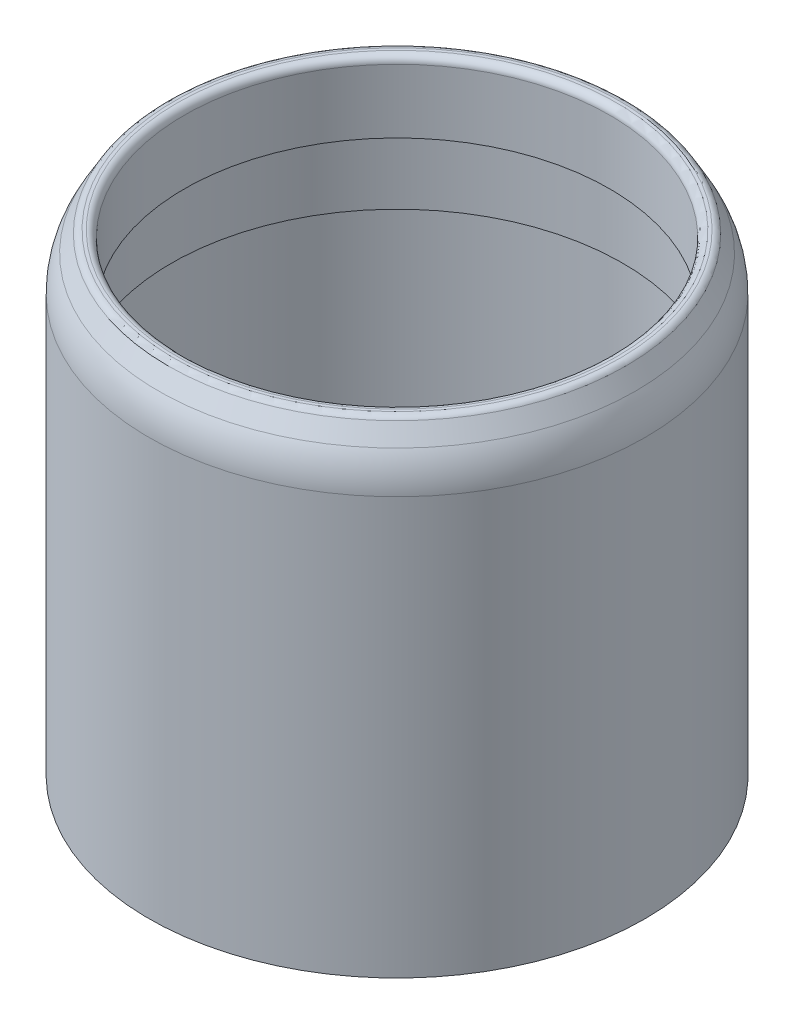
ISO-10303-21;
HEADER;
FILE_DESCRIPTION(('STEP AP214'),'2;1');
FILE_NAME('part.step','',(''),(''),'','','');
FILE_SCHEMA(('AUTOMOTIVE_DESIGN { 1 0 10303 214 1 1 1 1 }'));
ENDSEC;
DATA;
#1=APPLICATION_CONTEXT('core data for automotive mechanical design processes');
#2=APPLICATION_PROTOCOL_DEFINITION('international standard','automotive_design',2000,#1);
#3=PRODUCT_CONTEXT('',#1,'mechanical');
#4=PRODUCT('Part','Part','',(#3));
#5=PRODUCT_RELATED_PRODUCT_CATEGORY('part','',(#4));
#6=PRODUCT_DEFINITION_FORMATION('','',#4);
#7=PRODUCT_DEFINITION_CONTEXT('part definition',#1,'design');
#8=PRODUCT_DEFINITION('design','',#6,#7);
#9=PRODUCT_DEFINITION_SHAPE('','',#8);
#10=(LENGTH_UNIT() NAMED_UNIT(*) SI_UNIT(.MILLI.,.METRE.));
#11=(NAMED_UNIT(*) PLANE_ANGLE_UNIT() SI_UNIT($,.RADIAN.));
#12=(NAMED_UNIT(*) SI_UNIT($,.STERADIAN.) SOLID_ANGLE_UNIT());
#13=UNCERTAINTY_MEASURE_WITH_UNIT(LENGTH_MEASURE(1.E-05),#10,'distance_accuracy_value','');
#14=(GEOMETRIC_REPRESENTATION_CONTEXT(3) GLOBAL_UNCERTAINTY_ASSIGNED_CONTEXT((#13)) GLOBAL_UNIT_ASSIGNED_CONTEXT((#10,
#11,#12)) REPRESENTATION_CONTEXT('',''));
#15=CARTESIAN_POINT('',(0.,0.,0.));
#16=DIRECTION('',(0.,0.,1.));
#17=DIRECTION('',(1.,0.,0.));
#18=AXIS2_PLACEMENT_3D('',#15,#16,#17);
#19=CARTESIAN_POINT('',(9.,-0.3,0.));
#20=DIRECTION('',(0.,-1.,0.));
#21=DIRECTION('',(-0.999982833638038,0.,0.00585938812848122));
#22=AXIS2_PLACEMENT_3D('',#19,#20,#21);
#23=TOROIDAL_SURFACE('',#22,9.426794919243,0.3);
#24=CARTESIAN_POINT('',(9.,-0.1500000056238,0.));
#25=DIRECTION('',(0.,-1.,0.));
#26=DIRECTION('',(-1.,0.,0.));
#27=AXIS2_PLACEMENT_3D('',#24,#25,#26);
#28=CIRCLE('',#27,9.686602543625);
#29=CARTESIAN_POINT('',(18.686602543625,-0.150000005623806,0.));
#30=VERTEX_POINT('',#29);
#31=CARTESIAN_POINT('',(18.6864362598996,-0.1500000056238,-0.0567575639494312));
#32=VERTEX_POINT('',#31);
#33=EDGE_CURVE('E117',#30,#32,#28,.T.);
#34=ORIENTED_EDGE('',*,*,#33,.F.);
#35=CARTESIAN_POINT('',(9.,-0.1500000056238,0.));
#36=DIRECTION('',(0.,-1.,0.));
#37=DIRECTION('',(-1.,0.,0.));
#38=AXIS2_PLACEMENT_3D('',#35,#36,#37);
#39=CIRCLE('',#38,9.686602543625);
#40=EDGE_CURVE('E28',#32,#30,#39,.T.);
#41=ORIENTED_EDGE('',*,*,#40,.F.);
#42=CARTESIAN_POINT('',(18.4266330954693,-0.3,-0.0552352502394384));
#43=DIRECTION('',(0.0058593881284811,0.,0.999982833638038));
#44=DIRECTION('',(0.999982833638038,0.,-0.0058593881284811));
#45=AXIS2_PLACEMENT_3D('',#42,#43,#44);
#46=CIRCLE('',#45,0.3);
#47=CARTESIAN_POINT('',(18.426633109589,0.,-0.055235250322173));
#48=VERTEX_POINT('',#47);
#49=EDGE_CURVE('E11',#32,#48,#46,.T.);
#50=ORIENTED_EDGE('',*,*,#49,.T.);
#51=CARTESIAN_POINT('',(9.,0.,0.));
#52=DIRECTION('',(0.,-1.,0.));
#53=DIRECTION('',(-1.,0.,0.));
#54=AXIS2_PLACEMENT_3D('',#51,#52,#53);
#55=CIRCLE('',#54,9.426794933363);
#56=EDGE_CURVE('E123',#48,#48,#55,.T.);
#57=ORIENTED_EDGE('',*,*,#56,.T.);
#58=ORIENTED_EDGE('',*,*,#49,.F.);
#59=EDGE_LOOP('',(#34,#41,#50,#57,#58));
#60=FACE_BOUND('',#59,.T.);
#61=ADVANCED_FACE('F17',(#60),#23,.T.);
#62=CARTESIAN_POINT('',(9.,-0.5063464648881,0.));
#63=DIRECTION('',(0.,-1.,0.));
#64=DIRECTION('',(-1.,0.,0.));
#65=AXIS2_PLACEMENT_3D('',#62,#63,#64);
#66=CONICAL_SURFACE('',#65,9.892339267806,0.523598775598299);
#67=CARTESIAN_POINT('',(9.,-0.8626933041054,0.));
#68=DIRECTION('',(0.,1.,0.));
#69=DIRECTION('',(-1.,0.,0.));
#70=AXIS2_PLACEMENT_3D('',#67,#68,#69);
#71=CIRCLE('',#70,10.09807621135);
#72=CARTESIAN_POINT('',(19.09807621135,-0.8626933041054,0.));
#73=VERTEX_POINT('',#72);
#74=EDGE_CURVE('E154',#73,#73,#71,.T.);
#75=ORIENTED_EDGE('',*,*,#74,.T.);
#76=DIRECTION('',(-0.5,0.866025403784439,0.));
#77=VECTOR('',#76,1.);
#78=CARTESIAN_POINT('',(18.892339267806,-0.5063464648881,0.));
#79=LINE('',#78,#77);
#80=EDGE_CURVE('E158',#73,#30,#79,.T.);
#81=ORIENTED_EDGE('',*,*,#80,.T.);
#82=ORIENTED_EDGE('',*,*,#33,.T.);
#83=ORIENTED_EDGE('',*,*,#40,.T.);
#84=ORIENTED_EDGE('',*,*,#80,.F.);
#85=EDGE_LOOP('',(#75,#81,#82,#83,#84));
#86=FACE_BOUND('',#85,.T.);
#87=ADVANCED_FACE('F183',(#86),#66,.T.);
#88=CARTESIAN_POINT('',(9.,-2.362693304105,0.));
#89=DIRECTION('',(0.,-1.,0.));
#90=DIRECTION('',(-1.,0.,0.));
#91=AXIS2_PLACEMENT_3D('',#88,#89,#90);
#92=TOROIDAL_SURFACE('',#91,7.5,3.);
#93=CARTESIAN_POINT('',(9.,-2.362693304105,0.));
#94=DIRECTION('',(0.,-1.,0.));
#95=DIRECTION('',(-1.,0.,0.));
#96=AXIS2_PLACEMENT_3D('',#93,#94,#95);
#97=CIRCLE('',#96,10.5);
#98=CARTESIAN_POINT('',(19.5,-2.362693304105,0.));
#99=VERTEX_POINT('',#98);
#100=EDGE_CURVE('E100',#99,#99,#97,.T.);
#101=ORIENTED_EDGE('',*,*,#100,.F.);
#102=CARTESIAN_POINT('',(16.5,-2.362693304105,0.));
#103=DIRECTION('',(0.,0.,1.));
#104=DIRECTION('',(1.,0.,0.));
#105=AXIS2_PLACEMENT_3D('',#102,#103,#104);
#106=CIRCLE('',#105,3.);
#107=EDGE_CURVE('E131',#99,#73,#106,.T.);
#108=ORIENTED_EDGE('',*,*,#107,.T.);
#109=ORIENTED_EDGE('',*,*,#74,.F.);
#110=ORIENTED_EDGE('',*,*,#107,.F.);
#111=EDGE_LOOP('',(#101,#108,#109,#110));
#112=FACE_BOUND('',#111,.T.);
#113=ADVANCED_FACE('F206',(#112),#92,.T.);
#114=CARTESIAN_POINT('',(9.,1.,0.));
#115=DIRECTION('',(0.,-1.,0.));
#116=DIRECTION('',(-1.,0.,0.));
#117=AXIS2_PLACEMENT_3D('',#114,#115,#116);
#118=CYLINDRICAL_SURFACE('',#117,10.5);
#119=CARTESIAN_POINT('',(9.,-20.,0.));
#120=DIRECTION('',(0.,-1.,0.));
#121=DIRECTION('',(-1.,0.,0.));
#122=AXIS2_PLACEMENT_3D('',#119,#120,#121);
#123=CIRCLE('',#122,10.5);
#124=CARTESIAN_POINT('',(19.5,-20.,0.));
#125=VERTEX_POINT('',#124);
#126=EDGE_CURVE('E98',#125,#125,#123,.T.);
#127=ORIENTED_EDGE('',*,*,#126,.F.);
#128=DIRECTION('',(0.,1.,0.));
#129=VECTOR('',#128,1.);
#130=CARTESIAN_POINT('',(19.5,1.,0.));
#131=LINE('',#130,#129);
#132=EDGE_CURVE('E95',#125,#99,#131,.T.);
#133=ORIENTED_EDGE('',*,*,#132,.T.);
#134=ORIENTED_EDGE('',*,*,#100,.T.);
#135=ORIENTED_EDGE('',*,*,#132,.F.);
#136=EDGE_LOOP('',(#127,#133,#134,#135));
#137=FACE_BOUND('',#136,.T.);
#138=ADVANCED_FACE('F97',(#137),#118,.T.);
#139=CARTESIAN_POINT('',(9.,-20.,0.));
#140=DIRECTION('',(0.,-1.,0.));
#141=DIRECTION('',(0.,0.,-1.));
#142=AXIS2_PLACEMENT_3D('',#139,#140,#141);
#143=PLANE('',#142);
#144=CARTESIAN_POINT('',(9.,-20.,0.));
#145=DIRECTION('',(0.,-1.,0.));
#146=DIRECTION('',(-1.,0.,0.));
#147=AXIS2_PLACEMENT_3D('',#144,#145,#146);
#148=CIRCLE('',#147,9.55);
#149=CARTESIAN_POINT('',(18.55,-20.,0.));
#150=VERTEX_POINT('',#149);
#151=EDGE_CURVE('E106',#150,#150,#148,.T.);
#152=ORIENTED_EDGE('',*,*,#151,.F.);
#153=EDGE_LOOP('',(#152));
#154=FACE_BOUND('',#153,.T.);
#155=ORIENTED_EDGE('',*,*,#126,.T.);
#156=EDGE_LOOP('',(#155));
#157=FACE_BOUND('',#156,.T.);
#158=ADVANCED_FACE('F104',(#154,#157),#143,.T.);
#159=CARTESIAN_POINT('',(9.,1.,0.));
#160=DIRECTION('',(0.,-1.,0.));
#161=DIRECTION('',(-1.,0.,0.));
#162=AXIS2_PLACEMENT_3D('',#159,#160,#161);
#163=CYLINDRICAL_SURFACE('',#162,9.55);
#164=CARTESIAN_POINT('',(9.,-18.,0.));
#165=DIRECTION('',(0.,-1.,0.));
#166=DIRECTION('',(-1.,0.,0.));
#167=AXIS2_PLACEMENT_3D('',#164,#165,#166);
#168=CIRCLE('',#167,9.55);
#169=CARTESIAN_POINT('',(18.55,-18.,0.));
#170=VERTEX_POINT('',#169);
#171=EDGE_CURVE('E141',#170,#170,#168,.T.);
#172=ORIENTED_EDGE('',*,*,#171,.F.);
#173=DIRECTION('',(0.,-1.,0.));
#174=VECTOR('',#173,1.);
#175=CARTESIAN_POINT('',(18.55,1.,0.));
#176=LINE('',#175,#174);
#177=EDGE_CURVE('E112',#170,#150,#176,.T.);
#178=ORIENTED_EDGE('',*,*,#177,.T.);
#179=ORIENTED_EDGE('',*,*,#151,.T.);
#180=ORIENTED_EDGE('',*,*,#177,.F.);
#181=EDGE_LOOP('',(#172,#178,#179,#180));
#182=FACE_BOUND('',#181,.T.);
#183=ADVANCED_FACE('F209',(#182),#163,.F.);
#184=CARTESIAN_POINT('',(9.,-18.,0.));
#185=DIRECTION('',(0.,-1.,0.));
#186=DIRECTION('',(0.,0.,-1.));
#187=AXIS2_PLACEMENT_3D('',#184,#185,#186);
#188=PLANE('',#187);
#189=ORIENTED_EDGE('',*,*,#171,.T.);
#190=EDGE_LOOP('',(#189));
#191=FACE_BOUND('',#190,.T.);
#192=CARTESIAN_POINT('',(9.,-18.,0.));
#193=DIRECTION('',(0.,-1.,0.));
#194=DIRECTION('',(-1.,0.,0.));
#195=AXIS2_PLACEMENT_3D('',#192,#193,#194);
#196=CIRCLE('',#195,9.75);
#197=CARTESIAN_POINT('',(18.75,-18.,0.));
#198=VERTEX_POINT('',#197);
#199=EDGE_CURVE('E144',#198,#198,#196,.T.);
#200=ORIENTED_EDGE('',*,*,#199,.F.);
#201=EDGE_LOOP('',(#200));
#202=FACE_BOUND('',#201,.T.);
#203=ADVANCED_FACE('F230',(#191,#202),#188,.F.);
#204=CARTESIAN_POINT('',(9.,1.,0.));
#205=DIRECTION('',(0.,-1.,0.));
#206=DIRECTION('',(-1.,0.,0.));
#207=AXIS2_PLACEMENT_3D('',#204,#205,#206);
#208=CYLINDRICAL_SURFACE('',#207,9.75);
#209=CARTESIAN_POINT('',(9.,-6.,0.));
#210=DIRECTION('',(0.,-1.,0.));
#211=DIRECTION('',(-1.,0.,0.));
#212=AXIS2_PLACEMENT_3D('',#209,#210,#211);
#213=CIRCLE('',#212,9.75);
#214=CARTESIAN_POINT('',(18.75,-6.,0.));
#215=VERTEX_POINT('',#214);
#216=EDGE_CURVE('E135',#215,#215,#213,.T.);
#217=ORIENTED_EDGE('',*,*,#216,.F.);
#218=DIRECTION('',(0.,-1.,0.));
#219=VECTOR('',#218,1.);
#220=CARTESIAN_POINT('',(18.75,1.,0.));
#221=LINE('',#220,#219);
#222=EDGE_CURVE('E140',#215,#198,#221,.T.);
#223=ORIENTED_EDGE('',*,*,#222,.T.);
#224=ORIENTED_EDGE('',*,*,#199,.T.);
#225=ORIENTED_EDGE('',*,*,#222,.F.);
#226=EDGE_LOOP('',(#217,#223,#224,#225));
#227=FACE_BOUND('',#226,.T.);
#228=ADVANCED_FACE('F219',(#227),#208,.F.);
#229=CARTESIAN_POINT('',(9.,-6.,0.));
#230=DIRECTION('',(0.,-1.,0.));
#231=DIRECTION('',(0.,0.,-1.));
#232=AXIS2_PLACEMENT_3D('',#229,#230,#231);
#233=PLANE('',#232);
#234=CARTESIAN_POINT('',(9.,-6.,0.));
#235=DIRECTION('',(0.,-1.,0.));
#236=DIRECTION('',(-1.,0.,0.));
#237=AXIS2_PLACEMENT_3D('',#234,#235,#236);
#238=CIRCLE('',#237,9.55);
#239=CARTESIAN_POINT('',(18.55,-6.,0.));
#240=VERTEX_POINT('',#239);
#241=EDGE_CURVE('E132',#240,#240,#238,.T.);
#242=ORIENTED_EDGE('',*,*,#241,.F.);
#243=EDGE_LOOP('',(#242));
#244=FACE_BOUND('',#243,.T.);
#245=ORIENTED_EDGE('',*,*,#216,.T.);
#246=EDGE_LOOP('',(#245));
#247=FACE_BOUND('',#246,.T.);
#248=ADVANCED_FACE('F212',(#244,#247),#233,.T.);
#249=CARTESIAN_POINT('',(9.,1.,0.));
#250=DIRECTION('',(0.,-1.,0.));
#251=DIRECTION('',(-1.,0.,0.));
#252=AXIS2_PLACEMENT_3D('',#249,#250,#251);
#253=CYLINDRICAL_SURFACE('',#252,9.55);
#254=CARTESIAN_POINT('',(9.,-3.,0.));
#255=DIRECTION('',(0.,-1.,0.));
#256=DIRECTION('',(-1.,0.,0.));
#257=AXIS2_PLACEMENT_3D('',#254,#255,#256);
#258=CIRCLE('',#257,9.55);
#259=CARTESIAN_POINT('',(18.55,-3.,0.));
#260=VERTEX_POINT('',#259);
#261=EDGE_CURVE('E149',#260,#260,#258,.T.);
#262=ORIENTED_EDGE('',*,*,#261,.F.);
#263=DIRECTION('',(0.,-1.,0.));
#264=VECTOR('',#263,1.);
#265=CARTESIAN_POINT('',(18.55,1.,0.));
#266=LINE('',#265,#264);
#267=EDGE_CURVE('E136',#260,#240,#266,.T.);
#268=ORIENTED_EDGE('',*,*,#267,.T.);
#269=ORIENTED_EDGE('',*,*,#241,.T.);
#270=ORIENTED_EDGE('',*,*,#267,.F.);
#271=EDGE_LOOP('',(#262,#268,#269,#270));
#272=FACE_BOUND('',#271,.T.);
#273=ADVANCED_FACE('F210',(#272),#253,.F.);
#274=CARTESIAN_POINT('',(9.,-3.,0.));
#275=DIRECTION('',(0.,-1.,0.));
#276=DIRECTION('',(0.,0.,-1.));
#277=AXIS2_PLACEMENT_3D('',#274,#275,#276);
#278=PLANE('',#277);
#279=CARTESIAN_POINT('',(9.,-3.,0.));
#280=DIRECTION('',(0.,-1.,0.));
#281=DIRECTION('',(-1.,0.,0.));
#282=AXIS2_PLACEMENT_3D('',#279,#280,#281);
#283=CIRCLE('',#282,9.);
#284=CARTESIAN_POINT('',(18.,-3.,0.));
#285=VERTEX_POINT('',#284);
#286=EDGE_CURVE('E146',#285,#285,#283,.T.);
#287=ORIENTED_EDGE('',*,*,#286,.F.);
#288=EDGE_LOOP('',(#287));
#289=FACE_BOUND('',#288,.T.);
#290=ORIENTED_EDGE('',*,*,#261,.T.);
#291=EDGE_LOOP('',(#290));
#292=FACE_BOUND('',#291,.T.);
#293=ADVANCED_FACE('F19',(#289,#292),#278,.T.);
#294=CARTESIAN_POINT('',(9.,1.,0.));
#295=DIRECTION('',(0.,-1.,0.));
#296=DIRECTION('',(-1.,0.,0.));
#297=AXIS2_PLACEMENT_3D('',#294,#295,#296);
#298=CYLINDRICAL_SURFACE('',#297,9.);
#299=CARTESIAN_POINT('',(9.,-0.3,0.));
#300=DIRECTION('',(0.,-1.,0.));
#301=DIRECTION('',(-1.,0.,0.));
#302=AXIS2_PLACEMENT_3D('',#299,#300,#301);
#303=CIRCLE('',#302,9.);
#304=CARTESIAN_POINT('',(18.,-0.3,0.));
#305=VERTEX_POINT('',#304);
#306=EDGE_CURVE('E21',#305,#305,#303,.T.);
#307=ORIENTED_EDGE('',*,*,#306,.F.);
#308=DIRECTION('',(0.,-1.,0.));
#309=VECTOR('',#308,1.);
#310=CARTESIAN_POINT('',(18.,1.,0.));
#311=LINE('',#310,#309);
#312=EDGE_CURVE('E150',#305,#285,#311,.T.);
#313=ORIENTED_EDGE('',*,*,#312,.T.);
#314=ORIENTED_EDGE('',*,*,#286,.T.);
#315=ORIENTED_EDGE('',*,*,#312,.F.);
#316=EDGE_LOOP('',(#307,#313,#314,#315));
#317=FACE_BOUND('',#316,.T.);
#318=ADVANCED_FACE('F196',(#317),#298,.F.);
#319=CARTESIAN_POINT('',(9.,-0.3,0.));
#320=DIRECTION('',(0.,-1.,0.));
#321=DIRECTION('',(-1.,0.,0.));
#322=AXIS2_PLACEMENT_3D('',#319,#320,#321);
#323=TOROIDAL_SURFACE('',#322,9.3,0.3);
#324=CARTESIAN_POINT('',(9.,0.,0.));
#325=DIRECTION('',(0.,-1.,0.));
#326=DIRECTION('',(-1.,0.,0.));
#327=AXIS2_PLACEMENT_3D('',#324,#325,#326);
#328=CIRCLE('',#327,9.3);
#329=CARTESIAN_POINT('',(18.3,0.,0.));
#330=VERTEX_POINT('',#329);
#331=EDGE_CURVE('E118',#330,#330,#328,.T.);
#332=ORIENTED_EDGE('',*,*,#331,.F.);
#333=CARTESIAN_POINT('',(18.3,-0.3,0.));
#334=DIRECTION('',(0.,0.,1.));
#335=DIRECTION('',(1.,0.,0.));
#336=AXIS2_PLACEMENT_3D('',#333,#334,#335);
#337=CIRCLE('',#336,0.3);
#338=EDGE_CURVE('E122',#330,#305,#337,.T.);
#339=ORIENTED_EDGE('',*,*,#338,.T.);
#340=ORIENTED_EDGE('',*,*,#306,.T.);
#341=ORIENTED_EDGE('',*,*,#338,.F.);
#342=EDGE_LOOP('',(#332,#339,#340,#341));
#343=FACE_BOUND('',#342,.T.);
#344=ADVANCED_FACE('F189',(#343),#323,.T.);
#345=CARTESIAN_POINT('',(9.,0.,0.));
#346=DIRECTION('',(0.,-1.,0.));
#347=DIRECTION('',(0.,0.,-1.));
#348=AXIS2_PLACEMENT_3D('',#345,#346,#347);
#349=PLANE('',#348);
#350=ORIENTED_EDGE('',*,*,#331,.T.);
#351=EDGE_LOOP('',(#350));
#352=FACE_BOUND('',#351,.T.);
#353=ORIENTED_EDGE('',*,*,#56,.F.);
#354=EDGE_LOOP('',(#353));
#355=FACE_BOUND('',#354,.T.);
#356=ADVANCED_FACE('F187',(#352,#355),#349,.F.);
#357=CLOSED_SHELL('',(#61,#87,#113,#138,#158,#183,#203,#228,#248,#273,#293,#318,#344,#356));
#358=MANIFOLD_SOLID_BREP('B1',#357);
#359=ADVANCED_BREP_SHAPE_REPRESENTATION('',(#18,#358),#14);
#360=SHAPE_DEFINITION_REPRESENTATION(#9,#359);
ENDSEC;
END-ISO-10303-21;
